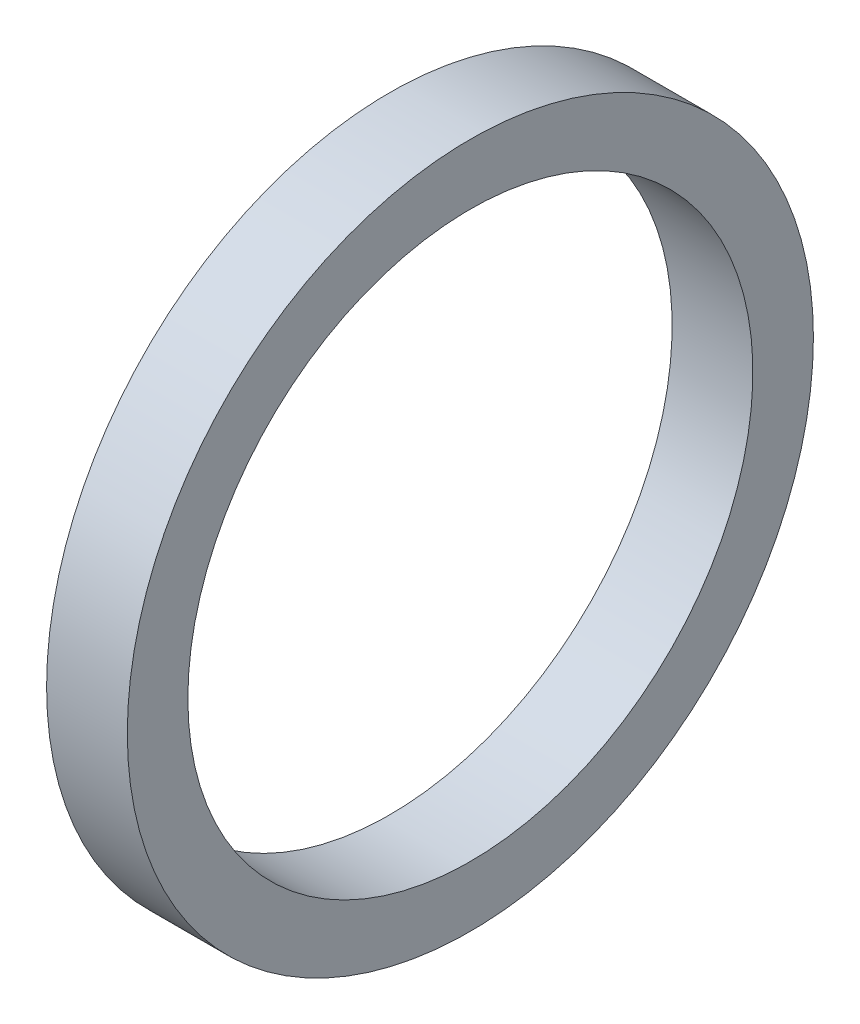
ISO-10303-21;
HEADER;
FILE_DESCRIPTION(('STEP AP214'),'2;1');
FILE_NAME('part.step','',(''),(''),'','','');
FILE_SCHEMA(('AUTOMOTIVE_DESIGN { 1 0 10303 214 1 1 1 1 }'));
ENDSEC;
DATA;
#1=APPLICATION_CONTEXT('core data for automotive mechanical design processes');
#2=APPLICATION_PROTOCOL_DEFINITION('international standard','automotive_design',2000,#1);
#3=PRODUCT_CONTEXT('',#1,'mechanical');
#4=PRODUCT('Part','Part','',(#3));
#5=PRODUCT_RELATED_PRODUCT_CATEGORY('part','',(#4));
#6=PRODUCT_DEFINITION_FORMATION('','',#4);
#7=PRODUCT_DEFINITION_CONTEXT('part definition',#1,'design');
#8=PRODUCT_DEFINITION('design','',#6,#7);
#9=PRODUCT_DEFINITION_SHAPE('','',#8);
#10=(LENGTH_UNIT() NAMED_UNIT(*) SI_UNIT(.MILLI.,.METRE.));
#11=(NAMED_UNIT(*) PLANE_ANGLE_UNIT() SI_UNIT($,.RADIAN.));
#12=(NAMED_UNIT(*) SI_UNIT($,.STERADIAN.) SOLID_ANGLE_UNIT());
#13=UNCERTAINTY_MEASURE_WITH_UNIT(LENGTH_MEASURE(1.E-05),#10,'distance_accuracy_value','');
#14=(GEOMETRIC_REPRESENTATION_CONTEXT(3) GLOBAL_UNCERTAINTY_ASSIGNED_CONTEXT((#13)) GLOBAL_UNIT_ASSIGNED_CONTEXT((#10,
#11,#12)) REPRESENTATION_CONTEXT('',''));
#15=CARTESIAN_POINT('',(0.,0.,0.));
#16=DIRECTION('',(0.,0.,1.));
#17=DIRECTION('',(1.,0.,0.));
#18=AXIS2_PLACEMENT_3D('',#15,#16,#17);
#19=CARTESIAN_POINT('',(0.,42.5,0.));
#20=DIRECTION('',(1.,0.,0.));
#21=DIRECTION('',(0.,0.,-1.));
#22=AXIS2_PLACEMENT_3D('',#19,#20,#21);
#23=PLANE('',#22);
#24=CARTESIAN_POINT('',(0.,0.,0.));
#25=DIRECTION('',(-1.,0.,0.));
#26=DIRECTION('',(0.,0.,1.));
#27=AXIS2_PLACEMENT_3D('',#24,#25,#26);
#28=CIRCLE('',#27,35.);
#29=CARTESIAN_POINT('',(0.,0.,35.));
#30=VERTEX_POINT('',#29);
#31=EDGE_CURVE('E10',#30,#30,#28,.T.);
#32=ORIENTED_EDGE('',*,*,#31,.F.);
#33=EDGE_LOOP('',(#32));
#34=FACE_BOUND('',#33,.T.);
#35=CARTESIAN_POINT('',(0.,0.,0.));
#36=DIRECTION('',(-1.,0.,0.));
#37=DIRECTION('',(0.,0.,1.));
#38=AXIS2_PLACEMENT_3D('',#35,#36,#37);
#39=CIRCLE('',#38,42.5);
#40=CARTESIAN_POINT('',(0.,0.,42.5));
#41=VERTEX_POINT('',#40);
#42=EDGE_CURVE('E54',#41,#41,#39,.T.);
#43=ORIENTED_EDGE('',*,*,#42,.T.);
#44=EDGE_LOOP('',(#43));
#45=FACE_BOUND('',#44,.T.);
#46=ADVANCED_FACE('F41',(#34,#45),#23,.F.);
#47=CARTESIAN_POINT('',(-59.6592581066923,0.,0.));
#48=DIRECTION('',(-1.,0.,0.));
#49=DIRECTION('',(0.,0.,1.));
#50=AXIS2_PLACEMENT_3D('',#47,#48,#49);
#51=CYLINDRICAL_SURFACE('',#50,35.);
#52=CARTESIAN_POINT('',(10.,0.,0.));
#53=DIRECTION('',(-1.,0.,0.));
#54=DIRECTION('',(0.,0.,1.));
#55=AXIS2_PLACEMENT_3D('',#52,#53,#54);
#56=CIRCLE('',#55,35.);
#57=CARTESIAN_POINT('',(10.,0.,35.));
#58=VERTEX_POINT('',#57);
#59=EDGE_CURVE('E50',#58,#58,#56,.T.);
#60=ORIENTED_EDGE('',*,*,#59,.F.);
#61=EDGE_LOOP('',(#60));
#62=FACE_BOUND('',#61,.T.);
#63=ORIENTED_EDGE('',*,*,#31,.T.);
#64=EDGE_LOOP('',(#63));
#65=FACE_BOUND('',#64,.T.);
#66=ADVANCED_FACE('F68',(#62,#65),#51,.F.);
#67=CARTESIAN_POINT('',(10.,35.,0.));
#68=DIRECTION('',(-1.,0.,0.));
#69=DIRECTION('',(0.,0.,1.));
#70=AXIS2_PLACEMENT_3D('',#67,#68,#69);
#71=PLANE('',#70);
#72=CARTESIAN_POINT('',(10.,0.,0.));
#73=DIRECTION('',(-1.,0.,0.));
#74=DIRECTION('',(0.,0.,1.));
#75=AXIS2_PLACEMENT_3D('',#72,#73,#74);
#76=CIRCLE('',#75,42.5);
#77=CARTESIAN_POINT('',(10.,0.,42.5));
#78=VERTEX_POINT('',#77);
#79=EDGE_CURVE('E51',#78,#78,#76,.T.);
#80=ORIENTED_EDGE('',*,*,#79,.F.);
#81=EDGE_LOOP('',(#80));
#82=FACE_BOUND('',#81,.T.);
#83=ORIENTED_EDGE('',*,*,#59,.T.);
#84=EDGE_LOOP('',(#83));
#85=FACE_BOUND('',#84,.T.);
#86=ADVANCED_FACE('F65',(#82,#85),#71,.F.);
#87=CARTESIAN_POINT('',(-59.6592581066923,0.,0.));
#88=DIRECTION('',(-1.,0.,0.));
#89=DIRECTION('',(0.,0.,1.));
#90=AXIS2_PLACEMENT_3D('',#87,#88,#89);
#91=CYLINDRICAL_SURFACE('',#90,42.5);
#92=ORIENTED_EDGE('',*,*,#42,.F.);
#93=EDGE_LOOP('',(#92));
#94=FACE_BOUND('',#93,.T.);
#95=ORIENTED_EDGE('',*,*,#79,.T.);
#96=EDGE_LOOP('',(#95));
#97=FACE_BOUND('',#96,.T.);
#98=ADVANCED_FACE('F62',(#94,#97),#91,.T.);
#99=CLOSED_SHELL('',(#46,#66,#86,#98));
#100=MANIFOLD_SOLID_BREP('B2',#99);
#101=ADVANCED_BREP_SHAPE_REPRESENTATION('',(#18,#100),#14);
#102=SHAPE_DEFINITION_REPRESENTATION(#9,#101);
ENDSEC;
END-ISO-10303-21;
